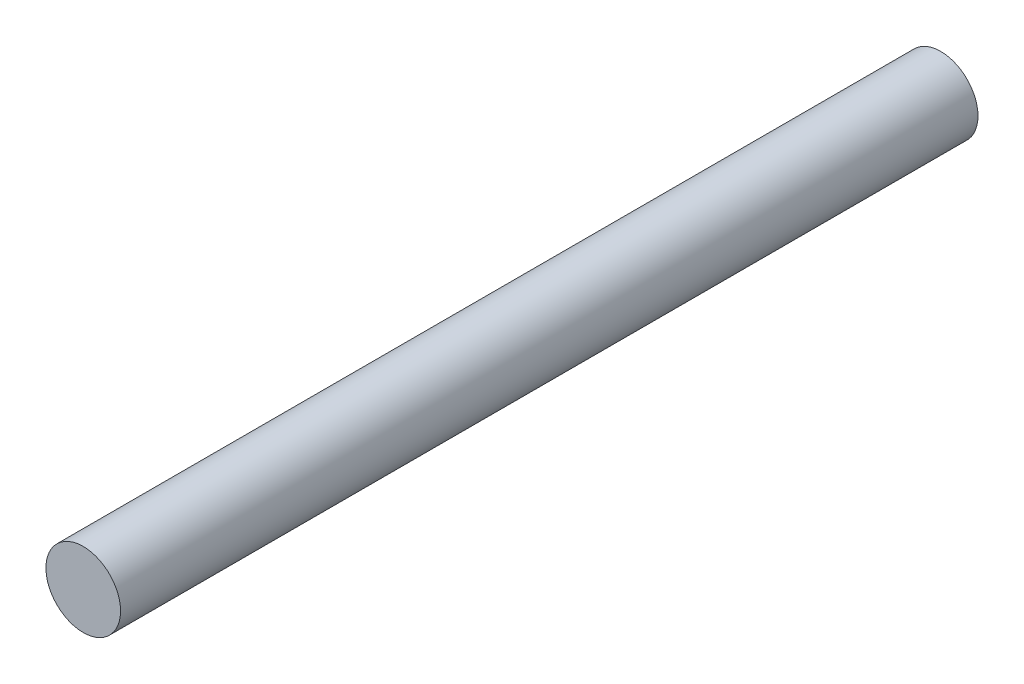
ISO-10303-21;
HEADER;
FILE_DESCRIPTION(('STEP AP214'),'2;1');
FILE_NAME('part.step','',(''),(''),'','','');
FILE_SCHEMA(('AUTOMOTIVE_DESIGN { 1 0 10303 214 1 1 1 1 }'));
ENDSEC;
DATA;
#1=APPLICATION_CONTEXT('core data for automotive mechanical design processes');
#2=APPLICATION_PROTOCOL_DEFINITION('international standard','automotive_design',2000,#1);
#3=PRODUCT_CONTEXT('',#1,'mechanical');
#4=PRODUCT('Part','Part','',(#3));
#5=PRODUCT_RELATED_PRODUCT_CATEGORY('part','',(#4));
#6=PRODUCT_DEFINITION_FORMATION('','',#4);
#7=PRODUCT_DEFINITION_CONTEXT('part definition',#1,'design');
#8=PRODUCT_DEFINITION('design','',#6,#7);
#9=PRODUCT_DEFINITION_SHAPE('','',#8);
#10=(LENGTH_UNIT() NAMED_UNIT(*) SI_UNIT(.MILLI.,.METRE.));
#11=(NAMED_UNIT(*) PLANE_ANGLE_UNIT() SI_UNIT($,.RADIAN.));
#12=(NAMED_UNIT(*) SI_UNIT($,.STERADIAN.) SOLID_ANGLE_UNIT());
#13=UNCERTAINTY_MEASURE_WITH_UNIT(LENGTH_MEASURE(1.E-05),#10,'distance_accuracy_value','');
#14=(GEOMETRIC_REPRESENTATION_CONTEXT(3) GLOBAL_UNCERTAINTY_ASSIGNED_CONTEXT((#13)) GLOBAL_UNIT_ASSIGNED_CONTEXT((#10,
#11,#12)) REPRESENTATION_CONTEXT('',''));
#15=CARTESIAN_POINT('',(0.,0.,0.));
#16=DIRECTION('',(0.,0.,1.));
#17=DIRECTION('',(1.,0.,0.));
#18=AXIS2_PLACEMENT_3D('',#15,#16,#17);
#19=CARTESIAN_POINT('',(27.271,-0.535,-22.8));
#20=DIRECTION('',(0.,0.,1.));
#21=DIRECTION('',(1.,0.,0.));
#22=AXIS2_PLACEMENT_3D('',#19,#20,#21);
#23=PLANE('',#22);
#24=CARTESIAN_POINT('',(27.271,-0.535,-22.8));
#25=DIRECTION('',(0.,0.,1.));
#26=DIRECTION('',(1.,0.,0.));
#27=AXIS2_PLACEMENT_3D('',#24,#25,#26);
#28=CIRCLE('',#27,0.261);
#29=CARTESIAN_POINT('',(27.532,-0.535,-22.8));
#30=VERTEX_POINT('',#29);
#31=EDGE_CURVE('E17',#30,#30,#28,.F.);
#32=ORIENTED_EDGE('',*,*,#31,.F.);
#33=EDGE_LOOP('',(#32));
#34=FACE_BOUND('',#33,.T.);
#35=ADVANCED_FACE('F14',(#34),#23,.T.);
#36=CARTESIAN_POINT('',(27.271,-0.535,-28.8));
#37=DIRECTION('',(0.,0.,-1.));
#38=DIRECTION('',(-1.,0.,0.));
#39=AXIS2_PLACEMENT_3D('',#36,#37,#38);
#40=PLANE('',#39);
#41=CARTESIAN_POINT('',(27.271,-0.535,-28.8));
#42=DIRECTION('',(0.,0.,1.));
#43=DIRECTION('',(1.,0.,0.));
#44=AXIS2_PLACEMENT_3D('',#41,#42,#43);
#45=CIRCLE('',#44,0.261);
#46=CARTESIAN_POINT('',(27.532,-0.535,-28.8));
#47=VERTEX_POINT('',#46);
#48=EDGE_CURVE('E10',#47,#47,#45,.T.);
#49=ORIENTED_EDGE('',*,*,#48,.F.);
#50=EDGE_LOOP('',(#49));
#51=FACE_BOUND('',#50,.T.);
#52=ADVANCED_FACE('F29',(#51),#40,.T.);
#53=CARTESIAN_POINT('',(27.271,-0.535,-25.8));
#54=DIRECTION('',(0.,0.,1.));
#55=DIRECTION('',(1.,0.,0.));
#56=AXIS2_PLACEMENT_3D('',#53,#54,#55);
#57=CYLINDRICAL_SURFACE('',#56,0.261);
#58=ORIENTED_EDGE('',*,*,#31,.T.);
#59=EDGE_LOOP('',(#58));
#60=FACE_BOUND('',#59,.T.);
#61=ORIENTED_EDGE('',*,*,#48,.T.);
#62=EDGE_LOOP('',(#61));
#63=FACE_BOUND('',#62,.T.);
#64=ADVANCED_FACE('F26',(#60,#63),#57,.T.);
#65=CLOSED_SHELL('',(#35,#52,#64));
#66=MANIFOLD_SOLID_BREP('B1',#65);
#67=ADVANCED_BREP_SHAPE_REPRESENTATION('',(#18,#66),#14);
#68=SHAPE_DEFINITION_REPRESENTATION(#9,#67);
ENDSEC;
END-ISO-10303-21;
